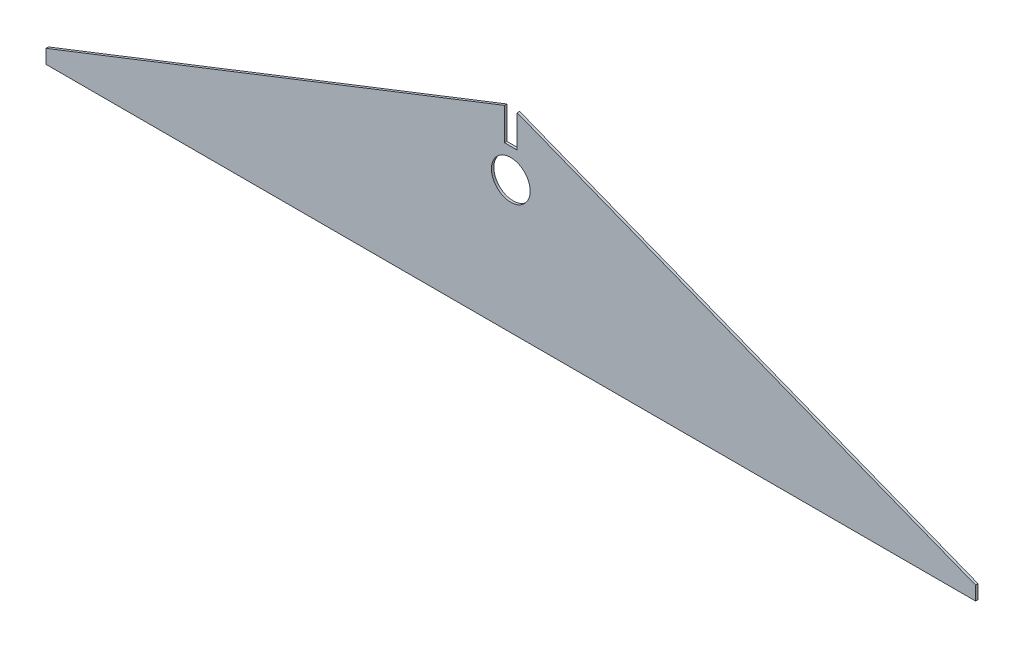
ISO-10303-21;
HEADER;
FILE_DESCRIPTION(('STEP AP214'),'2;1');
FILE_NAME('part.step','',(''),(''),'','','');
FILE_SCHEMA(('AUTOMOTIVE_DESIGN { 1 0 10303 214 1 1 1 1 }'));
ENDSEC;
DATA;
#1=APPLICATION_CONTEXT('core data for automotive mechanical design processes');
#2=APPLICATION_PROTOCOL_DEFINITION('international standard','automotive_design',2000,#1);
#3=PRODUCT_CONTEXT('',#1,'mechanical');
#4=PRODUCT('Part','Part','',(#3));
#5=PRODUCT_RELATED_PRODUCT_CATEGORY('part','',(#4));
#6=PRODUCT_DEFINITION_FORMATION('','',#4);
#7=PRODUCT_DEFINITION_CONTEXT('part definition',#1,'design');
#8=PRODUCT_DEFINITION('design','',#6,#7);
#9=PRODUCT_DEFINITION_SHAPE('','',#8);
#10=(LENGTH_UNIT() NAMED_UNIT(*) SI_UNIT(.MILLI.,.METRE.));
#11=(NAMED_UNIT(*) PLANE_ANGLE_UNIT() SI_UNIT($,.RADIAN.));
#12=(NAMED_UNIT(*) SI_UNIT($,.STERADIAN.) SOLID_ANGLE_UNIT());
#13=UNCERTAINTY_MEASURE_WITH_UNIT(LENGTH_MEASURE(1.E-05),#10,'distance_accuracy_value','');
#14=(GEOMETRIC_REPRESENTATION_CONTEXT(3) GLOBAL_UNCERTAINTY_ASSIGNED_CONTEXT((#13)) GLOBAL_UNIT_ASSIGNED_CONTEXT((#10,
#11,#12)) REPRESENTATION_CONTEXT('',''));
#15=CARTESIAN_POINT('',(0.,0.,0.));
#16=DIRECTION('',(0.,0.,1.));
#17=DIRECTION('',(1.,0.,0.));
#18=AXIS2_PLACEMENT_3D('',#15,#16,#17);
#19=CARTESIAN_POINT('',(0.,0.,19.05));
#20=DIRECTION('',(0.,0.,-1.));
#21=DIRECTION('',(-1.,0.,0.));
#22=AXIS2_PLACEMENT_3D('',#19,#20,#21);
#23=PLANE('',#22);
#24=DIRECTION('',(1.,0.,0.));
#25=VECTOR('',#24,1.);
#26=CARTESIAN_POINT('',(0.,0.,19.05));
#27=LINE('',#26,#25);
#28=CARTESIAN_POINT('',(-3657.6,-4.47926813256136E-13,19.05));
#29=VERTEX_POINT('',#28);
#30=CARTESIAN_POINT('',(3657.6,0.,19.05));
#31=VERTEX_POINT('',#30);
#32=EDGE_CURVE('E91',#29,#31,#27,.T.);
#33=ORIENTED_EDGE('',*,*,#32,.T.);
#34=DIRECTION('',(0.,1.,0.));
#35=VECTOR('',#34,1.);
#36=CARTESIAN_POINT('',(3657.6,0.,19.05));
#37=LINE('',#36,#35);
#38=CARTESIAN_POINT('',(3657.6,109.22,19.05));
#39=VERTEX_POINT('',#38);
#40=EDGE_CURVE('E176',#31,#39,#37,.T.);
#41=ORIENTED_EDGE('',*,*,#40,.T.);
#42=DIRECTION('',(-0.930942611056996,0.365165517154047,0.));
#43=VECTOR('',#42,1.);
#44=CARTESIAN_POINT('',(50.8,1524.,19.05));
#45=LINE('',#44,#43);
#46=CARTESIAN_POINT('',(50.8,1524.,19.05));
#47=VERTEX_POINT('',#46);
#48=EDGE_CURVE('E159',#39,#47,#45,.T.);
#49=ORIENTED_EDGE('',*,*,#48,.T.);
#50=DIRECTION('',(0.,-1.,0.));
#51=VECTOR('',#50,1.);
#52=CARTESIAN_POINT('',(50.8,1270.,19.05));
#53=LINE('',#52,#51);
#54=CARTESIAN_POINT('',(50.8,1270.,19.05));
#55=VERTEX_POINT('',#54);
#56=EDGE_CURVE('E172',#47,#55,#53,.T.);
#57=ORIENTED_EDGE('',*,*,#56,.T.);
#58=DIRECTION('',(-1.,0.,0.));
#59=VECTOR('',#58,1.);
#60=CARTESIAN_POINT('',(-50.8,1270.,19.05));
#61=LINE('',#60,#59);
#62=CARTESIAN_POINT('',(-50.8,1270.,19.05));
#63=VERTEX_POINT('',#62);
#64=EDGE_CURVE('E111',#55,#63,#61,.T.);
#65=ORIENTED_EDGE('',*,*,#64,.T.);
#66=DIRECTION('',(0.,1.,0.));
#67=VECTOR('',#66,1.);
#68=CARTESIAN_POINT('',(-50.8,1524.,19.05));
#69=LINE('',#68,#67);
#70=CARTESIAN_POINT('',(-50.8,1524.,19.05));
#71=VERTEX_POINT('',#70);
#72=EDGE_CURVE('E105',#63,#71,#69,.T.);
#73=ORIENTED_EDGE('',*,*,#72,.T.);
#74=DIRECTION('',(-0.930942611056996,-0.365165517154047,0.));
#75=VECTOR('',#74,1.);
#76=CARTESIAN_POINT('',(-50.8,1524.,19.05));
#77=LINE('',#76,#75);
#78=CARTESIAN_POINT('',(-3657.6,109.22,19.05));
#79=VERTEX_POINT('',#78);
#80=EDGE_CURVE('E109',#71,#79,#77,.T.);
#81=ORIENTED_EDGE('',*,*,#80,.T.);
#82=DIRECTION('',(0.,-1.,0.));
#83=VECTOR('',#82,1.);
#84=CARTESIAN_POINT('',(-3657.6,-4.47926813256136E-13,19.05));
#85=LINE('',#84,#83);
#86=EDGE_CURVE('E49',#79,#29,#85,.T.);
#87=ORIENTED_EDGE('',*,*,#86,.T.);
#88=EDGE_LOOP('',(#33,#41,#49,#57,#65,#73,#81,#87));
#89=FACE_BOUND('',#88,.T.);
#90=CARTESIAN_POINT('',(0.,1041.4,19.05));
#91=DIRECTION('',(0.,0.,1.));
#92=DIRECTION('',(1.,0.,0.));
#93=AXIS2_PLACEMENT_3D('',#90,#91,#92);
#94=CIRCLE('',#93,152.4);
#95=CARTESIAN_POINT('',(-152.4,1041.4,19.05));
#96=VERTEX_POINT('',#95);
#97=EDGE_CURVE('E131',#96,#96,#94,.T.);
#98=ORIENTED_EDGE('',*,*,#97,.F.);
#99=EDGE_LOOP('',(#98));
#100=FACE_BOUND('',#99,.T.);
#101=ADVANCED_FACE('F32',(#89,#100),#23,.F.);
#102=CARTESIAN_POINT('',(0.,0.,0.));
#103=DIRECTION('',(0.,0.,-1.));
#104=DIRECTION('',(-1.,0.,0.));
#105=AXIS2_PLACEMENT_3D('',#102,#103,#104);
#106=PLANE('',#105);
#107=DIRECTION('',(1.,0.,0.));
#108=VECTOR('',#107,1.);
#109=CARTESIAN_POINT('',(0.,0.,0.));
#110=LINE('',#109,#108);
#111=CARTESIAN_POINT('',(-3657.6,-4.47926813256136E-13,0.));
#112=VERTEX_POINT('',#111);
#113=CARTESIAN_POINT('',(3657.6,0.,0.));
#114=VERTEX_POINT('',#113);
#115=EDGE_CURVE('E85',#112,#114,#110,.T.);
#116=ORIENTED_EDGE('',*,*,#115,.F.);
#117=DIRECTION('',(0.,-1.,0.));
#118=VECTOR('',#117,1.);
#119=CARTESIAN_POINT('',(-3657.6,-4.47926813256136E-13,0.));
#120=LINE('',#119,#118);
#121=CARTESIAN_POINT('',(-3657.6,109.22,0.));
#122=VERTEX_POINT('',#121);
#123=EDGE_CURVE('E141',#122,#112,#120,.T.);
#124=ORIENTED_EDGE('',*,*,#123,.F.);
#125=DIRECTION('',(-0.930942611056996,-0.365165517154047,0.));
#126=VECTOR('',#125,1.);
#127=CARTESIAN_POINT('',(-50.8,1524.,0.));
#128=LINE('',#127,#126);
#129=CARTESIAN_POINT('',(-50.8,1524.,0.));
#130=VERTEX_POINT('',#129);
#131=EDGE_CURVE('E78',#130,#122,#128,.T.);
#132=ORIENTED_EDGE('',*,*,#131,.F.);
#133=DIRECTION('',(0.,1.,0.));
#134=VECTOR('',#133,1.);
#135=CARTESIAN_POINT('',(-50.8,1524.,0.));
#136=LINE('',#135,#134);
#137=CARTESIAN_POINT('',(-50.8,1270.,0.));
#138=VERTEX_POINT('',#137);
#139=EDGE_CURVE('E119',#138,#130,#136,.T.);
#140=ORIENTED_EDGE('',*,*,#139,.F.);
#141=DIRECTION('',(-1.,0.,0.));
#142=VECTOR('',#141,1.);
#143=CARTESIAN_POINT('',(-50.8,1270.,0.));
#144=LINE('',#143,#142);
#145=CARTESIAN_POINT('',(50.8,1270.,0.));
#146=VERTEX_POINT('',#145);
#147=EDGE_CURVE('E137',#146,#138,#144,.T.);
#148=ORIENTED_EDGE('',*,*,#147,.F.);
#149=DIRECTION('',(0.,-1.,0.));
#150=VECTOR('',#149,1.);
#151=CARTESIAN_POINT('',(50.8,1270.,0.));
#152=LINE('',#151,#150);
#153=CARTESIAN_POINT('',(50.8,1524.,0.));
#154=VERTEX_POINT('',#153);
#155=EDGE_CURVE('E135',#154,#146,#152,.T.);
#156=ORIENTED_EDGE('',*,*,#155,.F.);
#157=DIRECTION('',(-0.930942611056996,0.365165517154047,0.));
#158=VECTOR('',#157,1.);
#159=CARTESIAN_POINT('',(50.8,1524.,0.));
#160=LINE('',#159,#158);
#161=CARTESIAN_POINT('',(3657.6,109.22,0.));
#162=VERTEX_POINT('',#161);
#163=EDGE_CURVE('E133',#162,#154,#160,.T.);
#164=ORIENTED_EDGE('',*,*,#163,.F.);
#165=DIRECTION('',(0.,1.,0.));
#166=VECTOR('',#165,1.);
#167=CARTESIAN_POINT('',(3657.6,0.,0.));
#168=LINE('',#167,#166);
#169=EDGE_CURVE('E130',#114,#162,#168,.T.);
#170=ORIENTED_EDGE('',*,*,#169,.F.);
#171=EDGE_LOOP('',(#116,#124,#132,#140,#148,#156,#164,#170));
#172=FACE_BOUND('',#171,.T.);
#173=CARTESIAN_POINT('',(0.,1041.4,0.));
#174=DIRECTION('',(0.,0.,1.));
#175=DIRECTION('',(1.,0.,0.));
#176=AXIS2_PLACEMENT_3D('',#173,#174,#175);
#177=CIRCLE('',#176,152.4);
#178=CARTESIAN_POINT('',(-152.4,1041.4,0.));
#179=VERTEX_POINT('',#178);
#180=EDGE_CURVE('E179',#179,#179,#177,.T.);
#181=ORIENTED_EDGE('',*,*,#180,.T.);
#182=EDGE_LOOP('',(#181));
#183=FACE_BOUND('',#182,.T.);
#184=ADVANCED_FACE('F163',(#172,#183),#106,.T.);
#185=CARTESIAN_POINT('',(0.,0.,19.05));
#186=DIRECTION('',(0.,1.,0.));
#187=DIRECTION('',(0.,0.,1.));
#188=AXIS2_PLACEMENT_3D('',#185,#186,#187);
#189=PLANE('',#188);
#190=ORIENTED_EDGE('',*,*,#115,.T.);
#191=DIRECTION('',(0.,0.,-1.));
#192=VECTOR('',#191,1.);
#193=CARTESIAN_POINT('',(3657.6,0.,19.05));
#194=LINE('',#193,#192);
#195=EDGE_CURVE('E11',#31,#114,#194,.T.);
#196=ORIENTED_EDGE('',*,*,#195,.F.);
#197=ORIENTED_EDGE('',*,*,#32,.F.);
#198=DIRECTION('',(0.,0.,-1.));
#199=VECTOR('',#198,1.);
#200=CARTESIAN_POINT('',(-3657.6,-4.47926813256136E-13,19.05));
#201=LINE('',#200,#199);
#202=EDGE_CURVE('E125',#29,#112,#201,.T.);
#203=ORIENTED_EDGE('',*,*,#202,.T.);
#204=EDGE_LOOP('',(#190,#196,#197,#203));
#205=FACE_BOUND('',#204,.T.);
#206=ADVANCED_FACE('F34',(#205),#189,.F.);
#207=CARTESIAN_POINT('',(3657.6,0.,19.05));
#208=DIRECTION('',(-1.,0.,0.));
#209=DIRECTION('',(0.,0.,1.));
#210=AXIS2_PLACEMENT_3D('',#207,#208,#209);
#211=PLANE('',#210);
#212=ORIENTED_EDGE('',*,*,#169,.T.);
#213=DIRECTION('',(0.,0.,-1.));
#214=VECTOR('',#213,1.);
#215=CARTESIAN_POINT('',(3657.6,109.22,19.05));
#216=LINE('',#215,#214);
#217=EDGE_CURVE('E41',#39,#162,#216,.T.);
#218=ORIENTED_EDGE('',*,*,#217,.F.);
#219=ORIENTED_EDGE('',*,*,#40,.F.);
#220=ORIENTED_EDGE('',*,*,#195,.T.);
#221=EDGE_LOOP('',(#212,#218,#219,#220));
#222=FACE_BOUND('',#221,.T.);
#223=ADVANCED_FACE('F208',(#222),#211,.F.);
#224=CARTESIAN_POINT('',(50.8,1524.,19.05));
#225=DIRECTION('',(-0.365165517154047,-0.930942611056996,0.));
#226=DIRECTION('',(0.930942611056996,-0.365165517154047,0.));
#227=AXIS2_PLACEMENT_3D('',#224,#225,#226);
#228=PLANE('',#227);
#229=ORIENTED_EDGE('',*,*,#163,.T.);
#230=DIRECTION('',(0.,0.,-1.));
#231=VECTOR('',#230,1.);
#232=CARTESIAN_POINT('',(50.8,1524.,19.05));
#233=LINE('',#232,#231);
#234=EDGE_CURVE('E150',#47,#154,#233,.T.);
#235=ORIENTED_EDGE('',*,*,#234,.F.);
#236=ORIENTED_EDGE('',*,*,#48,.F.);
#237=ORIENTED_EDGE('',*,*,#217,.T.);
#238=EDGE_LOOP('',(#229,#235,#236,#237));
#239=FACE_BOUND('',#238,.T.);
#240=ADVANCED_FACE('F157',(#239),#228,.F.);
#241=CARTESIAN_POINT('',(50.8,1270.,19.05));
#242=DIRECTION('',(1.,0.,0.));
#243=DIRECTION('',(0.,0.,-1.));
#244=AXIS2_PLACEMENT_3D('',#241,#242,#243);
#245=PLANE('',#244);
#246=ORIENTED_EDGE('',*,*,#155,.T.);
#247=DIRECTION('',(0.,0.,-1.));
#248=VECTOR('',#247,1.);
#249=CARTESIAN_POINT('',(50.8,1270.,19.05));
#250=LINE('',#249,#248);
#251=EDGE_CURVE('E147',#55,#146,#250,.T.);
#252=ORIENTED_EDGE('',*,*,#251,.F.);
#253=ORIENTED_EDGE('',*,*,#56,.F.);
#254=ORIENTED_EDGE('',*,*,#234,.T.);
#255=EDGE_LOOP('',(#246,#252,#253,#254));
#256=FACE_BOUND('',#255,.T.);
#257=ADVANCED_FACE('F168',(#256),#245,.F.);
#258=CARTESIAN_POINT('',(-50.8,1270.,19.05));
#259=DIRECTION('',(0.,-1.,0.));
#260=DIRECTION('',(0.,0.,-1.));
#261=AXIS2_PLACEMENT_3D('',#258,#259,#260);
#262=PLANE('',#261);
#263=ORIENTED_EDGE('',*,*,#147,.T.);
#264=DIRECTION('',(0.,0.,-1.));
#265=VECTOR('',#264,1.);
#266=CARTESIAN_POINT('',(-50.8,1270.,19.05));
#267=LINE('',#266,#265);
#268=EDGE_CURVE('E120',#63,#138,#267,.T.);
#269=ORIENTED_EDGE('',*,*,#268,.F.);
#270=ORIENTED_EDGE('',*,*,#64,.F.);
#271=ORIENTED_EDGE('',*,*,#251,.T.);
#272=EDGE_LOOP('',(#263,#269,#270,#271));
#273=FACE_BOUND('',#272,.T.);
#274=ADVANCED_FACE('F171',(#273),#262,.F.);
#275=CARTESIAN_POINT('',(-50.8,1524.,19.05));
#276=DIRECTION('',(-1.,0.,0.));
#277=DIRECTION('',(0.,-1.,0.));
#278=AXIS2_PLACEMENT_3D('',#275,#276,#277);
#279=PLANE('',#278);
#280=ORIENTED_EDGE('',*,*,#139,.T.);
#281=DIRECTION('',(0.,0.,-1.));
#282=VECTOR('',#281,1.);
#283=CARTESIAN_POINT('',(-50.8,1524.,19.05));
#284=LINE('',#283,#282);
#285=EDGE_CURVE('E116',#71,#130,#284,.T.);
#286=ORIENTED_EDGE('',*,*,#285,.F.);
#287=ORIENTED_EDGE('',*,*,#72,.F.);
#288=ORIENTED_EDGE('',*,*,#268,.T.);
#289=EDGE_LOOP('',(#280,#286,#287,#288));
#290=FACE_BOUND('',#289,.T.);
#291=ADVANCED_FACE('F117',(#290),#279,.F.);
#292=CARTESIAN_POINT('',(-50.8,1524.,19.05));
#293=DIRECTION('',(0.365165517154047,-0.930942611056996,0.));
#294=DIRECTION('',(0.930942611056996,0.365165517154047,0.));
#295=AXIS2_PLACEMENT_3D('',#292,#293,#294);
#296=PLANE('',#295);
#297=ORIENTED_EDGE('',*,*,#131,.T.);
#298=DIRECTION('',(0.,0.,-1.));
#299=VECTOR('',#298,1.);
#300=CARTESIAN_POINT('',(-3657.6,109.22,19.05));
#301=LINE('',#300,#299);
#302=EDGE_CURVE('E121',#79,#122,#301,.T.);
#303=ORIENTED_EDGE('',*,*,#302,.F.);
#304=ORIENTED_EDGE('',*,*,#80,.F.);
#305=ORIENTED_EDGE('',*,*,#285,.T.);
#306=EDGE_LOOP('',(#297,#303,#304,#305));
#307=FACE_BOUND('',#306,.T.);
#308=ADVANCED_FACE('F123',(#307),#296,.F.);
#309=CARTESIAN_POINT('',(-3657.6,-4.47926813256136E-13,19.05));
#310=DIRECTION('',(1.,0.,0.));
#311=DIRECTION('',(0.,0.,-1.));
#312=AXIS2_PLACEMENT_3D('',#309,#310,#311);
#313=PLANE('',#312);
#314=ORIENTED_EDGE('',*,*,#123,.T.);
#315=ORIENTED_EDGE('',*,*,#202,.F.);
#316=ORIENTED_EDGE('',*,*,#86,.F.);
#317=ORIENTED_EDGE('',*,*,#302,.T.);
#318=EDGE_LOOP('',(#314,#315,#316,#317));
#319=FACE_BOUND('',#318,.T.);
#320=ADVANCED_FACE('F195',(#319),#313,.F.);
#321=CARTESIAN_POINT('',(0.,1041.4,19.05));
#322=DIRECTION('',(0.,0.,-1.));
#323=DIRECTION('',(-1.,0.,0.));
#324=AXIS2_PLACEMENT_3D('',#321,#322,#323);
#325=CYLINDRICAL_SURFACE('',#324,152.4);
#326=CARTESIAN_POINT('',(-152.4,1041.4,19.05));
#327=CARTESIAN_POINT('',(-152.4,1041.4,18.8515625));
#328=CARTESIAN_POINT('',(-152.4,1041.4,18.653125));
#329=CARTESIAN_POINT('',(-152.4,1041.4,18.25625));
#330=CARTESIAN_POINT('',(-152.4,1041.4,18.0578125));
#331=CARTESIAN_POINT('',(-152.4,1041.4,17.6609375));
#332=CARTESIAN_POINT('',(-152.4,1041.4,17.4625));
#333=CARTESIAN_POINT('',(-152.4,1041.4,17.065625));
#334=CARTESIAN_POINT('',(-152.4,1041.4,16.8671875));
#335=CARTESIAN_POINT('',(-152.4,1041.4,16.4703125));
#336=CARTESIAN_POINT('',(-152.4,1041.4,16.271875));
#337=CARTESIAN_POINT('',(-152.4,1041.4,15.875));
#338=CARTESIAN_POINT('',(-152.4,1041.4,15.6765625));
#339=CARTESIAN_POINT('',(-152.4,1041.4,15.2796875));
#340=CARTESIAN_POINT('',(-152.4,1041.4,15.08125));
#341=CARTESIAN_POINT('',(-152.4,1041.4,14.684375));
#342=CARTESIAN_POINT('',(-152.4,1041.4,14.4859375));
#343=CARTESIAN_POINT('',(-152.4,1041.4,14.0890625));
#344=CARTESIAN_POINT('',(-152.4,1041.4,13.890625));
#345=CARTESIAN_POINT('',(-152.4,1041.4,13.49375));
#346=CARTESIAN_POINT('',(-152.4,1041.4,13.2953125));
#347=CARTESIAN_POINT('',(-152.4,1041.4,12.8984375));
#348=CARTESIAN_POINT('',(-152.4,1041.4,12.7));
#349=CARTESIAN_POINT('',(-152.4,1041.4,12.303125));
#350=CARTESIAN_POINT('',(-152.4,1041.4,12.1046875));
#351=CARTESIAN_POINT('',(-152.4,1041.4,11.7078125));
#352=CARTESIAN_POINT('',(-152.4,1041.4,11.509375));
#353=CARTESIAN_POINT('',(-152.4,1041.4,11.1125));
#354=CARTESIAN_POINT('',(-152.4,1041.4,10.9140625));
#355=CARTESIAN_POINT('',(-152.4,1041.4,10.5171875));
#356=CARTESIAN_POINT('',(-152.4,1041.4,10.31875));
#357=CARTESIAN_POINT('',(-152.4,1041.4,9.921875));
#358=CARTESIAN_POINT('',(-152.4,1041.4,9.7234375));
#359=CARTESIAN_POINT('',(-152.4,1041.4,9.3265625));
#360=CARTESIAN_POINT('',(-152.4,1041.4,9.128125));
#361=CARTESIAN_POINT('',(-152.4,1041.4,8.73125));
#362=CARTESIAN_POINT('',(-152.4,1041.4,8.5328125));
#363=CARTESIAN_POINT('',(-152.4,1041.4,8.1359375));
#364=CARTESIAN_POINT('',(-152.4,1041.4,7.9375));
#365=CARTESIAN_POINT('',(-152.4,1041.4,7.540625));
#366=CARTESIAN_POINT('',(-152.4,1041.4,7.3421875));
#367=CARTESIAN_POINT('',(-152.4,1041.4,6.9453125));
#368=CARTESIAN_POINT('',(-152.4,1041.4,6.746875));
#369=CARTESIAN_POINT('',(-152.4,1041.4,6.35));
#370=CARTESIAN_POINT('',(-152.4,1041.4,6.1515625));
#371=CARTESIAN_POINT('',(-152.4,1041.4,5.7546875));
#372=CARTESIAN_POINT('',(-152.4,1041.4,5.55625));
#373=CARTESIAN_POINT('',(-152.4,1041.4,5.159375));
#374=CARTESIAN_POINT('',(-152.4,1041.4,4.9609375));
#375=CARTESIAN_POINT('',(-152.4,1041.4,4.5640625));
#376=CARTESIAN_POINT('',(-152.4,1041.4,4.365625));
#377=CARTESIAN_POINT('',(-152.4,1041.4,3.96875));
#378=CARTESIAN_POINT('',(-152.4,1041.4,3.7703125));
#379=CARTESIAN_POINT('',(-152.4,1041.4,3.3734375));
#380=CARTESIAN_POINT('',(-152.4,1041.4,3.175));
#381=CARTESIAN_POINT('',(-152.4,1041.4,2.778125));
#382=CARTESIAN_POINT('',(-152.4,1041.4,2.5796875));
#383=CARTESIAN_POINT('',(-152.4,1041.4,2.1828125));
#384=CARTESIAN_POINT('',(-152.4,1041.4,1.984375));
#385=CARTESIAN_POINT('',(-152.4,1041.4,1.5875));
#386=CARTESIAN_POINT('',(-152.4,1041.4,1.3890625));
#387=CARTESIAN_POINT('',(-152.4,1041.4,0.992187500000001));
#388=CARTESIAN_POINT('',(-152.4,1041.4,0.793750000000001));
#389=CARTESIAN_POINT('',(-152.4,1041.4,0.396875));
#390=CARTESIAN_POINT('',(-152.4,1041.4,0.1984375));
#391=CARTESIAN_POINT('',(-152.4,1041.4,0.));
#392=B_SPLINE_CURVE_WITH_KNOTS('',3,(#326,#327,#328,#329,#330,#331,#332,#333,#334,#335,#336,
#337,#338,#339,#340,#341,#342,#343,#344,#345,#346,#347,#348,#349,#350,#351,#352,#353,#354,#355,
#356,#357,#358,#359,#360,#361,#362,#363,#364,#365,#366,#367,#368,#369,#370,#371,#372,#373,#374,
#375,#376,#377,#378,#379,#380,#381,#382,#383,#384,#385,#386,#387,#388,#389,#390,#391),
.UNSPECIFIED.,.F.,.F.,(4,2,2,2,2,2,2,2,2,2,2,2,2,2,2,2,2,2,2,2,2,2,2,2,2,2,2,2,2,2,2,2,4),(0.,
0.5953125,1.190625,1.7859375,2.38125,2.9765625,3.571875,4.1671875,4.7625,5.3578125,5.953125,
6.5484375,7.14375,7.7390625,8.334375,8.9296875,9.525,10.1203125,10.715625,11.3109375,11.90625,
12.5015625,13.096875,13.6921875,14.2875,14.8828125,15.478125,16.0734375,16.66875,17.2640625,
17.859375,18.4546875,19.05),.UNSPECIFIED.);
#393=EDGE_CURVE('BSEAM185',#96,#179,#392,.T.);
#394=ORIENTED_EDGE('',*,*,#97,.T.);
#395=ORIENTED_EDGE('',*,*,#180,.F.);
#396=ORIENTED_EDGE('',*,*,#393,.T.);
#397=ORIENTED_EDGE('',*,*,#393,.F.);
#398=EDGE_LOOP('',(#394,#396,#395,#397));
#399=FACE_BOUND('',#398,.T.);
#400=ADVANCED_FACE('F185',(#399),#325,.F.);
#401=CLOSED_SHELL('',(#101,#184,#206,#223,#240,#257,#274,#291,#308,#320,#400));
#402=MANIFOLD_SOLID_BREP('B2',#401);
#403=ADVANCED_BREP_SHAPE_REPRESENTATION('',(#18,#402),#14);
#404=SHAPE_DEFINITION_REPRESENTATION(#9,#403);
ENDSEC;
END-ISO-10303-21;
